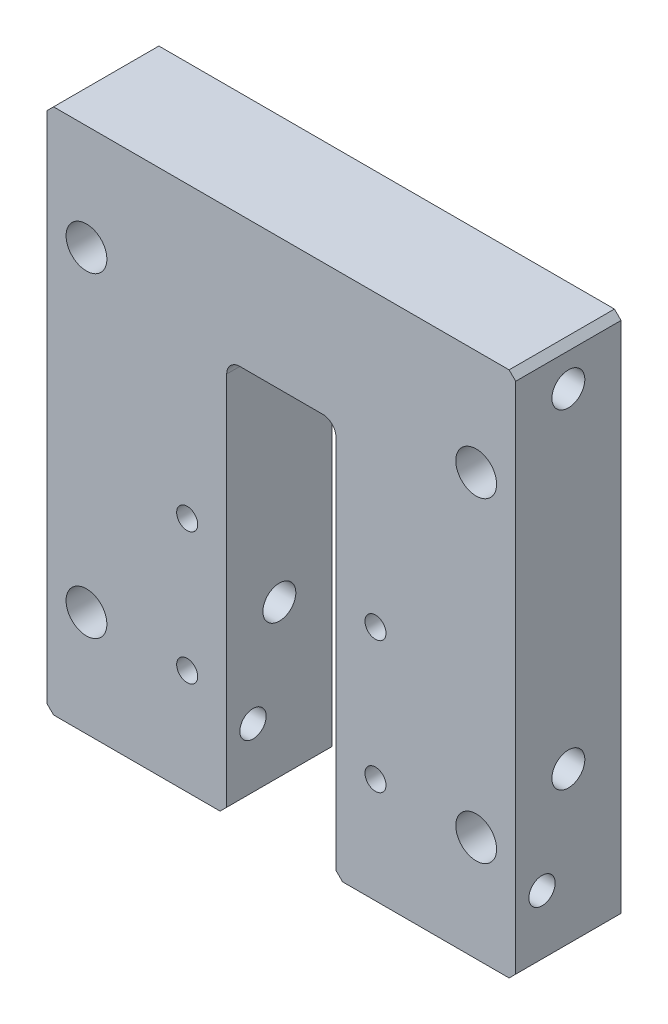
ISO-10303-21;
HEADER;
FILE_DESCRIPTION(('STEP AP214'),'2;1');
FILE_NAME('part.step','',(''),(''),'','','');
FILE_SCHEMA(('AUTOMOTIVE_DESIGN { 1 0 10303 214 1 1 1 1 }'));
ENDSEC;
DATA;
#1=APPLICATION_CONTEXT('core data for automotive mechanical design processes');
#2=APPLICATION_PROTOCOL_DEFINITION('international standard','automotive_design',2000,#1);
#3=PRODUCT_CONTEXT('',#1,'mechanical');
#4=PRODUCT('Part','Part','',(#3));
#5=PRODUCT_RELATED_PRODUCT_CATEGORY('part','',(#4));
#6=PRODUCT_DEFINITION_FORMATION('','',#4);
#7=PRODUCT_DEFINITION_CONTEXT('part definition',#1,'design');
#8=PRODUCT_DEFINITION('design','',#6,#7);
#9=PRODUCT_DEFINITION_SHAPE('','',#8);
#10=(LENGTH_UNIT() NAMED_UNIT(*) SI_UNIT(.MILLI.,.METRE.));
#11=(NAMED_UNIT(*) PLANE_ANGLE_UNIT() SI_UNIT($,.RADIAN.));
#12=(NAMED_UNIT(*) SI_UNIT($,.STERADIAN.) SOLID_ANGLE_UNIT());
#13=UNCERTAINTY_MEASURE_WITH_UNIT(LENGTH_MEASURE(1.E-05),#10,'distance_accuracy_value','');
#14=(GEOMETRIC_REPRESENTATION_CONTEXT(3) GLOBAL_UNCERTAINTY_ASSIGNED_CONTEXT((#13)) GLOBAL_UNIT_ASSIGNED_CONTEXT((#10,
#11,#12)) REPRESENTATION_CONTEXT('',''));
#15=CARTESIAN_POINT('',(0.,0.,0.));
#16=DIRECTION('',(0.,0.,1.));
#17=DIRECTION('',(1.,0.,0.));
#18=AXIS2_PLACEMENT_3D('',#15,#16,#17);
#19=CARTESIAN_POINT('',(0.,0.,8.));
#20=DIRECTION('',(0.,0.,-1.));
#21=DIRECTION('',(-1.,0.,0.));
#22=AXIS2_PLACEMENT_3D('',#19,#20,#21);
#23=PLANE('',#22);
#24=CARTESIAN_POINT('',(7.15,-12.,8.));
#25=DIRECTION('',(0.,0.,1.));
#26=DIRECTION('',(1.,0.,0.));
#27=AXIS2_PLACEMENT_3D('',#24,#25,#26);
#28=CIRCLE('',#27,0.799999999999999);
#29=CARTESIAN_POINT('',(7.95,-12.,8.));
#30=VERTEX_POINT('',#29);
#31=EDGE_CURVE('E385',#30,#30,#28,.T.);
#32=ORIENTED_EDGE('',*,*,#31,.F.);
#33=EDGE_LOOP('',(#32));
#34=FACE_BOUND('',#33,.T.);
#35=CARTESIAN_POINT('',(-7.15,-2.,8.));
#36=DIRECTION('',(0.,0.,1.));
#37=DIRECTION('',(1.,0.,0.));
#38=AXIS2_PLACEMENT_3D('',#35,#36,#37);
#39=CIRCLE('',#38,0.799999999999999);
#40=CARTESIAN_POINT('',(-6.35,-2.,8.));
#41=VERTEX_POINT('',#40);
#42=EDGE_CURVE('E367',#41,#41,#39,.T.);
#43=ORIENTED_EDGE('',*,*,#42,.F.);
#44=EDGE_LOOP('',(#43));
#45=FACE_BOUND('',#44,.T.);
#46=CARTESIAN_POINT('',(14.8,-12.,8.));
#47=DIRECTION('',(0.,0.,1.));
#48=DIRECTION('',(1.,0.,0.));
#49=AXIS2_PLACEMENT_3D('',#46,#47,#48);
#50=CIRCLE('',#49,1.55);
#51=CARTESIAN_POINT('',(16.35,-12.,8.));
#52=VERTEX_POINT('',#51);
#53=EDGE_CURVE('E356',#52,#52,#50,.T.);
#54=ORIENTED_EDGE('',*,*,#53,.F.);
#55=EDGE_LOOP('',(#54));
#56=FACE_BOUND('',#55,.T.);
#57=CARTESIAN_POINT('',(-14.8,-12.,8.));
#58=DIRECTION('',(0.,0.,1.));
#59=DIRECTION('',(1.,0.,0.));
#60=AXIS2_PLACEMENT_3D('',#57,#58,#59);
#61=CIRCLE('',#60,1.55);
#62=CARTESIAN_POINT('',(-13.25,-12.,8.));
#63=VERTEX_POINT('',#62);
#64=EDGE_CURVE('E359',#63,#63,#61,.T.);
#65=ORIENTED_EDGE('',*,*,#64,.F.);
#66=EDGE_LOOP('',(#65));
#67=FACE_BOUND('',#66,.T.);
#68=CARTESIAN_POINT('',(-14.8,12.,8.));
#69=DIRECTION('',(0.,0.,1.));
#70=DIRECTION('',(1.,0.,0.));
#71=AXIS2_PLACEMENT_3D('',#68,#69,#70);
#72=CIRCLE('',#71,1.55);
#73=CARTESIAN_POINT('',(-13.25,12.,8.));
#74=VERTEX_POINT('',#73);
#75=EDGE_CURVE('E355',#74,#74,#72,.T.);
#76=ORIENTED_EDGE('',*,*,#75,.F.);
#77=EDGE_LOOP('',(#76));
#78=FACE_BOUND('',#77,.T.);
#79=CARTESIAN_POINT('',(14.8,12.,8.));
#80=DIRECTION('',(0.,0.,1.));
#81=DIRECTION('',(1.,0.,0.));
#82=AXIS2_PLACEMENT_3D('',#79,#80,#81);
#83=CIRCLE('',#82,1.55);
#84=CARTESIAN_POINT('',(16.35,12.,8.));
#85=VERTEX_POINT('',#84);
#86=EDGE_CURVE('E273',#85,#85,#83,.T.);
#87=ORIENTED_EDGE('',*,*,#86,.F.);
#88=EDGE_LOOP('',(#87));
#89=FACE_BOUND('',#88,.T.);
#90=DIRECTION('',(0.,1.,0.));
#91=VECTOR('',#90,1.);
#92=CARTESIAN_POINT('',(17.8,-20.,8.));
#93=LINE('',#92,#91);
#94=CARTESIAN_POINT('',(17.8,-19.5,8.));
#95=VERTEX_POINT('',#94);
#96=CARTESIAN_POINT('',(17.8,19.5,8.));
#97=VERTEX_POINT('',#96);
#98=EDGE_CURVE('E316',#95,#97,#93,.T.);
#99=ORIENTED_EDGE('',*,*,#98,.T.);
#100=DIRECTION('',(0.707106781186543,-0.707106781186552,0.));
#101=VECTOR('',#100,1.);
#102=CARTESIAN_POINT('',(17.3,20.,8.));
#103=LINE('',#102,#101);
#104=CARTESIAN_POINT('',(17.3,20.,8.));
#105=VERTEX_POINT('',#104);
#106=EDGE_CURVE('E220',#97,#105,#103,.F.);
#107=ORIENTED_EDGE('',*,*,#106,.T.);
#108=DIRECTION('',(-1.,0.,0.));
#109=VECTOR('',#108,1.);
#110=CARTESIAN_POINT('',(-17.8,20.,8.));
#111=LINE('',#110,#109);
#112=CARTESIAN_POINT('',(-17.3,20.,8.));
#113=VERTEX_POINT('',#112);
#114=EDGE_CURVE('E318',#105,#113,#111,.T.);
#115=ORIENTED_EDGE('',*,*,#114,.T.);
#116=DIRECTION('',(0.707106781186552,0.707106781186543,0.));
#117=VECTOR('',#116,1.);
#118=CARTESIAN_POINT('',(-17.8,19.5,8.));
#119=LINE('',#118,#117);
#120=CARTESIAN_POINT('',(-17.8,19.5,8.));
#121=VERTEX_POINT('',#120);
#122=EDGE_CURVE('E211',#113,#121,#119,.F.);
#123=ORIENTED_EDGE('',*,*,#122,.T.);
#124=DIRECTION('',(0.,-1.,0.));
#125=VECTOR('',#124,1.);
#126=CARTESIAN_POINT('',(-17.8,-20.,8.));
#127=LINE('',#126,#125);
#128=CARTESIAN_POINT('',(-17.8,-19.5,8.));
#129=VERTEX_POINT('',#128);
#130=EDGE_CURVE('E245',#121,#129,#127,.T.);
#131=ORIENTED_EDGE('',*,*,#130,.T.);
#132=DIRECTION('',(-0.707106781186543,0.707106781186552,0.));
#133=VECTOR('',#132,1.);
#134=CARTESIAN_POINT('',(-17.3,-20.,8.));
#135=LINE('',#134,#133);
#136=CARTESIAN_POINT('',(-17.3,-20.,8.));
#137=VERTEX_POINT('',#136);
#138=EDGE_CURVE('E213',#129,#137,#135,.F.);
#139=ORIENTED_EDGE('',*,*,#138,.T.);
#140=DIRECTION('',(1.,0.,0.));
#141=VECTOR('',#140,1.);
#142=CARTESIAN_POINT('',(-17.8,-20.,8.));
#143=LINE('',#142,#141);
#144=CARTESIAN_POINT('',(-4.64999999999999,-20.,8.));
#145=VERTEX_POINT('',#144);
#146=EDGE_CURVE('E179',#137,#145,#143,.T.);
#147=ORIENTED_EDGE('',*,*,#146,.T.);
#148=DIRECTION('',(-0.707106781186548,-0.707106781186547,0.));
#149=VECTOR('',#148,1.);
#150=CARTESIAN_POINT('',(-4.64999999999999,-20.,8.));
#151=LINE('',#150,#149);
#152=CARTESIAN_POINT('',(-4.14999999999999,-19.5,8.));
#153=VERTEX_POINT('',#152);
#154=EDGE_CURVE('E58',#145,#153,#151,.F.);
#155=ORIENTED_EDGE('',*,*,#154,.T.);
#156=DIRECTION('',(0.,-1.,0.));
#157=VECTOR('',#156,1.);
#158=CARTESIAN_POINT('',(-4.14999999999999,-50.,8.));
#159=LINE('',#158,#157);
#160=CARTESIAN_POINT('',(-4.15,9.,8.));
#161=VERTEX_POINT('',#160);
#162=EDGE_CURVE('E264',#161,#153,#159,.T.);
#163=ORIENTED_EDGE('',*,*,#162,.F.);
#164=CARTESIAN_POINT('',(-3.15,9.,8.));
#165=DIRECTION('',(0.,0.,-1.));
#166=DIRECTION('',(-1.,0.,0.));
#167=AXIS2_PLACEMENT_3D('',#164,#165,#166);
#168=CIRCLE('',#167,1.);
#169=CARTESIAN_POINT('',(-3.15,10.,8.));
#170=VERTEX_POINT('',#169);
#171=EDGE_CURVE('E185',#161,#170,#168,.T.);
#172=ORIENTED_EDGE('',*,*,#171,.T.);
#173=DIRECTION('',(-1.,0.,0.));
#174=VECTOR('',#173,1.);
#175=CARTESIAN_POINT('',(-4.15,10.,8.));
#176=LINE('',#175,#174);
#177=CARTESIAN_POINT('',(3.15,10.,8.));
#178=VERTEX_POINT('',#177);
#179=EDGE_CURVE('E164',#178,#170,#176,.T.);
#180=ORIENTED_EDGE('',*,*,#179,.F.);
#181=CARTESIAN_POINT('',(3.15,9.,8.));
#182=DIRECTION('',(0.,0.,-1.));
#183=DIRECTION('',(-1.,0.,0.));
#184=AXIS2_PLACEMENT_3D('',#181,#182,#183);
#185=CIRCLE('',#184,1.);
#186=CARTESIAN_POINT('',(4.15,9.,8.));
#187=VERTEX_POINT('',#186);
#188=EDGE_CURVE('E292',#178,#187,#185,.T.);
#189=ORIENTED_EDGE('',*,*,#188,.T.);
#190=DIRECTION('',(0.,1.,0.));
#191=VECTOR('',#190,1.);
#192=CARTESIAN_POINT('',(4.15,-50.,8.));
#193=LINE('',#192,#191);
#194=CARTESIAN_POINT('',(4.15,-19.5,8.));
#195=VERTEX_POINT('',#194);
#196=EDGE_CURVE('E282',#195,#187,#193,.T.);
#197=ORIENTED_EDGE('',*,*,#196,.F.);
#198=DIRECTION('',(-0.707106781186548,0.707106781186547,0.));
#199=VECTOR('',#198,1.);
#200=CARTESIAN_POINT('',(4.65,-20.,8.));
#201=LINE('',#200,#199);
#202=CARTESIAN_POINT('',(4.65,-20.,8.));
#203=VERTEX_POINT('',#202);
#204=EDGE_CURVE('E216',#195,#203,#201,.F.);
#205=ORIENTED_EDGE('',*,*,#204,.T.);
#206=CARTESIAN_POINT('',(17.3,-20.,8.));
#207=VERTEX_POINT('',#206);
#208=EDGE_CURVE('E322',#203,#207,#143,.T.);
#209=ORIENTED_EDGE('',*,*,#208,.T.);
#210=DIRECTION('',(-0.707106781186552,-0.707106781186543,0.));
#211=VECTOR('',#210,1.);
#212=CARTESIAN_POINT('',(17.8,-19.5,8.));
#213=LINE('',#212,#211);
#214=EDGE_CURVE('E218',#207,#95,#213,.F.);
#215=ORIENTED_EDGE('',*,*,#214,.T.);
#216=EDGE_LOOP('',(#99,#107,#115,#123,#131,#139,#147,#155,#163,#172,#180,#189,#197,#205,#209,#215));
#217=FACE_BOUND('',#216,.T.);
#218=CARTESIAN_POINT('',(-7.15,-12.,8.));
#219=DIRECTION('',(0.,0.,1.));
#220=DIRECTION('',(1.,0.,0.));
#221=AXIS2_PLACEMENT_3D('',#218,#219,#220);
#222=CIRCLE('',#221,0.799999999999999);
#223=CARTESIAN_POINT('',(-6.35,-12.,8.));
#224=VERTEX_POINT('',#223);
#225=EDGE_CURVE('E373',#224,#224,#222,.T.);
#226=ORIENTED_EDGE('',*,*,#225,.F.);
#227=EDGE_LOOP('',(#226));
#228=FACE_BOUND('',#227,.T.);
#229=CARTESIAN_POINT('',(7.15,-2.,8.));
#230=DIRECTION('',(0.,0.,1.));
#231=DIRECTION('',(1.,0.,0.));
#232=AXIS2_PLACEMENT_3D('',#229,#230,#231);
#233=CIRCLE('',#232,0.799999999999999);
#234=CARTESIAN_POINT('',(7.95,-2.,8.));
#235=VERTEX_POINT('',#234);
#236=EDGE_CURVE('E379',#235,#235,#233,.T.);
#237=ORIENTED_EDGE('',*,*,#236,.F.);
#238=EDGE_LOOP('',(#237));
#239=FACE_BOUND('',#238,.T.);
#240=ADVANCED_FACE('F42',(#34,#45,#56,#67,#78,#89,#217,#228,#239),#23,.F.);
#241=CARTESIAN_POINT('',(-17.8,-20.,8.));
#242=DIRECTION('',(0.,1.,0.));
#243=DIRECTION('',(0.,0.,1.));
#244=AXIS2_PLACEMENT_3D('',#241,#242,#243);
#245=PLANE('',#244);
#246=DIRECTION('',(1.,0.,0.));
#247=VECTOR('',#246,1.);
#248=CARTESIAN_POINT('',(-17.8,-20.,0.));
#249=LINE('',#248,#247);
#250=CARTESIAN_POINT('',(4.65,-20.,0.));
#251=VERTEX_POINT('',#250);
#252=CARTESIAN_POINT('',(17.3,-20.,0.));
#253=VERTEX_POINT('',#252);
#254=EDGE_CURVE('E250',#251,#253,#249,.T.);
#255=ORIENTED_EDGE('',*,*,#254,.T.);
#256=DIRECTION('',(0.,0.,1.));
#257=VECTOR('',#256,1.);
#258=CARTESIAN_POINT('',(17.3,-20.,8.));
#259=LINE('',#258,#257);
#260=EDGE_CURVE('E225',#253,#207,#259,.T.);
#261=ORIENTED_EDGE('',*,*,#260,.T.);
#262=ORIENTED_EDGE('',*,*,#208,.F.);
#263=DIRECTION('',(0.,0.,-1.));
#264=VECTOR('',#263,1.);
#265=CARTESIAN_POINT('',(4.65,-20.,8.));
#266=LINE('',#265,#264);
#267=EDGE_CURVE('E222',#203,#251,#266,.T.);
#268=ORIENTED_EDGE('',*,*,#267,.T.);
#269=EDGE_LOOP('',(#255,#261,#262,#268));
#270=FACE_BOUND('',#269,.T.);
#271=ADVANCED_FACE('F426',(#270),#245,.F.);
#272=CARTESIAN_POINT('',(24.2,-15.,6.));
#273=DIRECTION('',(-1.,0.,0.));
#274=DIRECTION('',(0.,0.,1.));
#275=AXIS2_PLACEMENT_3D('',#272,#273,#274);
#276=CYLINDRICAL_SURFACE('',#275,1.);
#277=CARTESIAN_POINT('',(4.15,-15.,6.));
#278=DIRECTION('',(1.,0.,0.));
#279=DIRECTION('',(0.,0.,-1.));
#280=AXIS2_PLACEMENT_3D('',#277,#278,#279);
#281=CIRCLE('',#280,1.);
#282=CARTESIAN_POINT('',(4.15,-15.,5.));
#283=VERTEX_POINT('',#282);
#284=EDGE_CURVE('E265',#283,#283,#281,.F.);
#285=ORIENTED_EDGE('',*,*,#284,.T.);
#286=EDGE_LOOP('',(#285));
#287=FACE_BOUND('',#286,.T.);
#288=CARTESIAN_POINT('',(17.8,-15.,6.));
#289=DIRECTION('',(-1.,0.,0.));
#290=DIRECTION('',(0.,0.,1.));
#291=AXIS2_PLACEMENT_3D('',#288,#289,#290);
#292=CIRCLE('',#291,1.);
#293=CARTESIAN_POINT('',(17.8,-15.,7.));
#294=VERTEX_POINT('',#293);
#295=EDGE_CURVE('E309',#294,#294,#292,.T.);
#296=ORIENTED_EDGE('',*,*,#295,.F.);
#297=EDGE_LOOP('',(#296));
#298=FACE_BOUND('',#297,.T.);
#299=ADVANCED_FACE('F415',(#287,#298),#276,.F.);
#300=CARTESIAN_POINT('',(17.8,-20.,8.));
#301=DIRECTION('',(-1.,0.,0.));
#302=DIRECTION('',(0.,0.,1.));
#303=AXIS2_PLACEMENT_3D('',#300,#301,#302);
#304=PLANE('',#303);
#305=CARTESIAN_POINT('',(17.8,17.,4.));
#306=DIRECTION('',(-1.,0.,0.));
#307=DIRECTION('',(0.,0.,1.));
#308=AXIS2_PLACEMENT_3D('',#305,#306,#307);
#309=CIRCLE('',#308,1.24999999999999);
#310=CARTESIAN_POINT('',(17.8,17.,5.24999999999999));
#311=VERTEX_POINT('',#310);
#312=EDGE_CURVE('E395',#311,#311,#309,.T.);
#313=ORIENTED_EDGE('',*,*,#312,.T.);
#314=EDGE_LOOP('',(#313));
#315=FACE_BOUND('',#314,.T.);
#316=CARTESIAN_POINT('',(17.8,-8.,4.));
#317=DIRECTION('',(-1.,0.,0.));
#318=DIRECTION('',(0.,0.,1.));
#319=AXIS2_PLACEMENT_3D('',#316,#317,#318);
#320=CIRCLE('',#319,1.24999999999999);
#321=CARTESIAN_POINT('',(17.8,-8.,5.24999999999999));
#322=VERTEX_POINT('',#321);
#323=EDGE_CURVE('E286',#322,#322,#320,.T.);
#324=ORIENTED_EDGE('',*,*,#323,.T.);
#325=EDGE_LOOP('',(#324));
#326=FACE_BOUND('',#325,.T.);
#327=ORIENTED_EDGE('',*,*,#295,.T.);
#328=EDGE_LOOP('',(#327));
#329=FACE_BOUND('',#328,.T.);
#330=DIRECTION('',(0.,1.,0.));
#331=VECTOR('',#330,1.);
#332=CARTESIAN_POINT('',(17.8,-20.,0.));
#333=LINE('',#332,#331);
#334=CARTESIAN_POINT('',(17.8,-19.5,0.));
#335=VERTEX_POINT('',#334);
#336=CARTESIAN_POINT('',(17.8,19.5,0.));
#337=VERTEX_POINT('',#336);
#338=EDGE_CURVE('E256',#335,#337,#333,.T.);
#339=ORIENTED_EDGE('',*,*,#338,.T.);
#340=DIRECTION('',(0.,0.,1.));
#341=VECTOR('',#340,1.);
#342=CARTESIAN_POINT('',(17.8,19.5,8.));
#343=LINE('',#342,#341);
#344=EDGE_CURVE('E209',#337,#97,#343,.T.);
#345=ORIENTED_EDGE('',*,*,#344,.T.);
#346=ORIENTED_EDGE('',*,*,#98,.F.);
#347=DIRECTION('',(0.,0.,-1.));
#348=VECTOR('',#347,1.);
#349=CARTESIAN_POINT('',(17.8,-19.5,8.));
#350=LINE('',#349,#348);
#351=EDGE_CURVE('E206',#95,#335,#350,.T.);
#352=ORIENTED_EDGE('',*,*,#351,.T.);
#353=EDGE_LOOP('',(#339,#345,#346,#352));
#354=FACE_BOUND('',#353,.T.);
#355=ADVANCED_FACE('F327',(#315,#326,#329,#354),#304,.F.);
#356=CARTESIAN_POINT('',(-17.8,20.,8.));
#357=DIRECTION('',(0.,-1.,0.));
#358=DIRECTION('',(0.,0.,-1.));
#359=AXIS2_PLACEMENT_3D('',#356,#357,#358);
#360=PLANE('',#359);
#361=ORIENTED_EDGE('',*,*,#114,.F.);
#362=DIRECTION('',(0.,0.,-1.));
#363=VECTOR('',#362,1.);
#364=CARTESIAN_POINT('',(17.3,20.,8.));
#365=LINE('',#364,#363);
#366=CARTESIAN_POINT('',(17.3,20.,0.));
#367=VERTEX_POINT('',#366);
#368=EDGE_CURVE('E187',#105,#367,#365,.T.);
#369=ORIENTED_EDGE('',*,*,#368,.T.);
#370=DIRECTION('',(-1.,0.,0.));
#371=VECTOR('',#370,1.);
#372=CARTESIAN_POINT('',(-17.8,20.,0.));
#373=LINE('',#372,#371);
#374=CARTESIAN_POINT('',(-17.3,20.,0.));
#375=VERTEX_POINT('',#374);
#376=EDGE_CURVE('E251',#367,#375,#373,.T.);
#377=ORIENTED_EDGE('',*,*,#376,.T.);
#378=DIRECTION('',(0.,0.,1.));
#379=VECTOR('',#378,1.);
#380=CARTESIAN_POINT('',(-17.3,20.,8.));
#381=LINE('',#380,#379);
#382=EDGE_CURVE('E184',#375,#113,#381,.T.);
#383=ORIENTED_EDGE('',*,*,#382,.T.);
#384=EDGE_LOOP('',(#361,#369,#377,#383));
#385=FACE_BOUND('',#384,.T.);
#386=ADVANCED_FACE('F336',(#385),#360,.F.);
#387=CARTESIAN_POINT('',(-17.8,-20.,8.));
#388=DIRECTION('',(1.,0.,0.));
#389=DIRECTION('',(0.,0.,-1.));
#390=AXIS2_PLACEMENT_3D('',#387,#388,#389);
#391=PLANE('',#390);
#392=CARTESIAN_POINT('',(-17.8,17.,4.));
#393=DIRECTION('',(-1.,0.,0.));
#394=DIRECTION('',(0.,0.,1.));
#395=AXIS2_PLACEMENT_3D('',#392,#393,#394);
#396=CIRCLE('',#395,1.25);
#397=CARTESIAN_POINT('',(-17.8,17.,5.25));
#398=VERTEX_POINT('',#397);
#399=EDGE_CURVE('E398',#398,#398,#396,.T.);
#400=ORIENTED_EDGE('',*,*,#399,.F.);
#401=EDGE_LOOP('',(#400));
#402=FACE_BOUND('',#401,.T.);
#403=CARTESIAN_POINT('',(-17.8,-8.,4.));
#404=DIRECTION('',(-1.,0.,0.));
#405=DIRECTION('',(0.,0.,1.));
#406=AXIS2_PLACEMENT_3D('',#403,#404,#405);
#407=CIRCLE('',#406,1.25);
#408=CARTESIAN_POINT('',(-17.8,-8.,5.25));
#409=VERTEX_POINT('',#408);
#410=EDGE_CURVE('E392',#409,#409,#407,.T.);
#411=ORIENTED_EDGE('',*,*,#410,.F.);
#412=EDGE_LOOP('',(#411));
#413=FACE_BOUND('',#412,.T.);
#414=CARTESIAN_POINT('',(-17.8,-15.,6.));
#415=DIRECTION('',(-1.,0.,0.));
#416=DIRECTION('',(0.,0.,1.));
#417=AXIS2_PLACEMENT_3D('',#414,#415,#416);
#418=CIRCLE('',#417,1.);
#419=CARTESIAN_POINT('',(-17.8,-15.,7.));
#420=VERTEX_POINT('',#419);
#421=EDGE_CURVE('E306',#420,#420,#418,.T.);
#422=ORIENTED_EDGE('',*,*,#421,.F.);
#423=EDGE_LOOP('',(#422));
#424=FACE_BOUND('',#423,.T.);
#425=DIRECTION('',(0.,-1.,0.));
#426=VECTOR('',#425,1.);
#427=CARTESIAN_POINT('',(-17.8,-20.,0.));
#428=LINE('',#427,#426);
#429=CARTESIAN_POINT('',(-17.8,19.5,0.));
#430=VERTEX_POINT('',#429);
#431=CARTESIAN_POINT('',(-17.8,-19.5,0.));
#432=VERTEX_POINT('',#431);
#433=EDGE_CURVE('E242',#430,#432,#428,.T.);
#434=ORIENTED_EDGE('',*,*,#433,.T.);
#435=DIRECTION('',(0.,0.,1.));
#436=VECTOR('',#435,1.);
#437=CARTESIAN_POINT('',(-17.8,-19.5,8.));
#438=LINE('',#437,#436);
#439=EDGE_CURVE('E11',#432,#129,#438,.T.);
#440=ORIENTED_EDGE('',*,*,#439,.T.);
#441=ORIENTED_EDGE('',*,*,#130,.F.);
#442=DIRECTION('',(0.,0.,-1.));
#443=VECTOR('',#442,1.);
#444=CARTESIAN_POINT('',(-17.8,19.5,8.));
#445=LINE('',#444,#443);
#446=EDGE_CURVE('E51',#121,#430,#445,.T.);
#447=ORIENTED_EDGE('',*,*,#446,.T.);
#448=EDGE_LOOP('',(#434,#440,#441,#447));
#449=FACE_BOUND('',#448,.T.);
#450=ADVANCED_FACE('F241',(#402,#413,#424,#449),#391,.F.);
#451=CARTESIAN_POINT('',(-17.3,-20.,0.));
#452=VERTEX_POINT('',#451);
#453=CARTESIAN_POINT('',(-4.64999999999999,-20.,0.));
#454=VERTEX_POINT('',#453);
#455=EDGE_CURVE('E254',#452,#454,#249,.T.);
#456=ORIENTED_EDGE('',*,*,#455,.T.);
#457=DIRECTION('',(0.,0.,1.));
#458=VECTOR('',#457,1.);
#459=CARTESIAN_POINT('',(-4.64999999999999,-20.,8.));
#460=LINE('',#459,#458);
#461=EDGE_CURVE('E232',#454,#145,#460,.T.);
#462=ORIENTED_EDGE('',*,*,#461,.T.);
#463=ORIENTED_EDGE('',*,*,#146,.F.);
#464=DIRECTION('',(0.,0.,-1.));
#465=VECTOR('',#464,1.);
#466=CARTESIAN_POINT('',(-17.3,-20.,8.));
#467=LINE('',#466,#465);
#468=EDGE_CURVE('E229',#137,#452,#467,.T.);
#469=ORIENTED_EDGE('',*,*,#468,.T.);
#470=EDGE_LOOP('',(#456,#462,#463,#469));
#471=FACE_BOUND('',#470,.T.);
#472=ADVANCED_FACE('F345',(#471),#245,.F.);
#473=CARTESIAN_POINT('',(0.,0.,0.));
#474=DIRECTION('',(0.,0.,-1.));
#475=DIRECTION('',(-1.,0.,0.));
#476=AXIS2_PLACEMENT_3D('',#473,#474,#475);
#477=PLANE('',#476);
#478=CARTESIAN_POINT('',(7.15,-12.,0.));
#479=DIRECTION('',(0.,0.,1.));
#480=DIRECTION('',(1.,0.,0.));
#481=AXIS2_PLACEMENT_3D('',#478,#479,#480);
#482=CIRCLE('',#481,0.799999999999999);
#483=CARTESIAN_POINT('',(7.95,-12.,0.));
#484=VERTEX_POINT('',#483);
#485=EDGE_CURVE('E382',#484,#484,#482,.T.);
#486=ORIENTED_EDGE('',*,*,#485,.T.);
#487=EDGE_LOOP('',(#486));
#488=FACE_BOUND('',#487,.T.);
#489=CARTESIAN_POINT('',(7.15,-2.,0.));
#490=DIRECTION('',(0.,0.,1.));
#491=DIRECTION('',(1.,0.,0.));
#492=AXIS2_PLACEMENT_3D('',#489,#490,#491);
#493=CIRCLE('',#492,0.799999999999998);
#494=CARTESIAN_POINT('',(7.95,-2.,0.));
#495=VERTEX_POINT('',#494);
#496=EDGE_CURVE('E376',#495,#495,#493,.T.);
#497=ORIENTED_EDGE('',*,*,#496,.T.);
#498=EDGE_LOOP('',(#497));
#499=FACE_BOUND('',#498,.T.);
#500=CARTESIAN_POINT('',(-7.15,-12.,0.));
#501=DIRECTION('',(0.,0.,1.));
#502=DIRECTION('',(1.,0.,0.));
#503=AXIS2_PLACEMENT_3D('',#500,#501,#502);
#504=CIRCLE('',#503,0.799999999999998);
#505=CARTESIAN_POINT('',(-6.35,-12.,0.));
#506=VERTEX_POINT('',#505);
#507=EDGE_CURVE('E370',#506,#506,#504,.T.);
#508=ORIENTED_EDGE('',*,*,#507,.T.);
#509=EDGE_LOOP('',(#508));
#510=FACE_BOUND('',#509,.T.);
#511=CARTESIAN_POINT('',(-7.15,-2.,0.));
#512=DIRECTION('',(0.,0.,1.));
#513=DIRECTION('',(1.,0.,0.));
#514=AXIS2_PLACEMENT_3D('',#511,#512,#513);
#515=CIRCLE('',#514,0.799999999999998);
#516=CARTESIAN_POINT('',(-6.35,-2.,0.));
#517=VERTEX_POINT('',#516);
#518=EDGE_CURVE('E360',#517,#517,#515,.T.);
#519=ORIENTED_EDGE('',*,*,#518,.T.);
#520=EDGE_LOOP('',(#519));
#521=FACE_BOUND('',#520,.T.);
#522=CARTESIAN_POINT('',(14.8,-12.,0.));
#523=DIRECTION('',(0.,0.,-1.));
#524=DIRECTION('',(-1.,0.,0.));
#525=AXIS2_PLACEMENT_3D('',#522,#523,#524);
#526=CIRCLE('',#525,1.55);
#527=CARTESIAN_POINT('',(13.25,-12.,0.));
#528=VERTEX_POINT('',#527);
#529=EDGE_CURVE('E279',#528,#528,#526,.T.);
#530=ORIENTED_EDGE('',*,*,#529,.F.);
#531=EDGE_LOOP('',(#530));
#532=FACE_BOUND('',#531,.T.);
#533=CARTESIAN_POINT('',(-14.8,-12.,0.));
#534=DIRECTION('',(0.,0.,-1.));
#535=DIRECTION('',(-1.,0.,0.));
#536=AXIS2_PLACEMENT_3D('',#533,#534,#535);
#537=CIRCLE('',#536,1.55);
#538=CARTESIAN_POINT('',(-16.35,-12.,0.));
#539=VERTEX_POINT('',#538);
#540=EDGE_CURVE('E276',#539,#539,#537,.T.);
#541=ORIENTED_EDGE('',*,*,#540,.F.);
#542=EDGE_LOOP('',(#541));
#543=FACE_BOUND('',#542,.T.);
#544=CARTESIAN_POINT('',(-14.8,12.,0.));
#545=DIRECTION('',(0.,0.,-1.));
#546=DIRECTION('',(-1.,0.,0.));
#547=AXIS2_PLACEMENT_3D('',#544,#545,#546);
#548=CIRCLE('',#547,1.55);
#549=CARTESIAN_POINT('',(-16.35,12.,0.));
#550=VERTEX_POINT('',#549);
#551=EDGE_CURVE('E272',#550,#550,#548,.T.);
#552=ORIENTED_EDGE('',*,*,#551,.F.);
#553=EDGE_LOOP('',(#552));
#554=FACE_BOUND('',#553,.T.);
#555=CARTESIAN_POINT('',(14.8,12.,0.));
#556=DIRECTION('',(0.,0.,-1.));
#557=DIRECTION('',(-1.,0.,0.));
#558=AXIS2_PLACEMENT_3D('',#555,#556,#557);
#559=CIRCLE('',#558,1.55);
#560=CARTESIAN_POINT('',(13.25,12.,0.));
#561=VERTEX_POINT('',#560);
#562=EDGE_CURVE('E269',#561,#561,#559,.T.);
#563=ORIENTED_EDGE('',*,*,#562,.F.);
#564=EDGE_LOOP('',(#563));
#565=FACE_BOUND('',#564,.T.);
#566=ORIENTED_EDGE('',*,*,#376,.F.);
#567=DIRECTION('',(-0.707106781186543,0.707106781186552,0.));
#568=VECTOR('',#567,1.);
#569=CARTESIAN_POINT('',(18.6500000000001,18.6499999999999,0.));
#570=LINE('',#569,#568);
#571=EDGE_CURVE('E204',#367,#337,#570,.F.);
#572=ORIENTED_EDGE('',*,*,#571,.T.);
#573=ORIENTED_EDGE('',*,*,#338,.F.);
#574=DIRECTION('',(0.707106781186552,0.707106781186543,0.));
#575=VECTOR('',#574,1.);
#576=CARTESIAN_POINT('',(18.6499999999999,-18.6500000000001,0.));
#577=LINE('',#576,#575);
#578=EDGE_CURVE('E202',#335,#253,#577,.F.);
#579=ORIENTED_EDGE('',*,*,#578,.T.);
#580=ORIENTED_EDGE('',*,*,#254,.F.);
#581=DIRECTION('',(0.707106781186548,-0.707106781186547,0.));
#582=VECTOR('',#581,1.);
#583=CARTESIAN_POINT('',(-7.675,-7.67500000000002,0.));
#584=LINE('',#583,#582);
#585=CARTESIAN_POINT('',(4.15,-19.5,0.));
#586=VERTEX_POINT('',#585);
#587=EDGE_CURVE('E200',#251,#586,#584,.F.);
#588=ORIENTED_EDGE('',*,*,#587,.T.);
#589=DIRECTION('',(0.,-1.,0.));
#590=VECTOR('',#589,1.);
#591=CARTESIAN_POINT('',(4.15,0.,0.));
#592=LINE('',#591,#590);
#593=CARTESIAN_POINT('',(4.15,9.,0.));
#594=VERTEX_POINT('',#593);
#595=EDGE_CURVE('E267',#594,#586,#592,.T.);
#596=ORIENTED_EDGE('',*,*,#595,.F.);
#597=CARTESIAN_POINT('',(3.15,9.,0.));
#598=DIRECTION('',(0.,0.,-1.));
#599=DIRECTION('',(-1.,0.,0.));
#600=AXIS2_PLACEMENT_3D('',#597,#598,#599);
#601=CIRCLE('',#600,1.);
#602=CARTESIAN_POINT('',(3.15,10.,0.));
#603=VERTEX_POINT('',#602);
#604=EDGE_CURVE('E178',#594,#603,#601,.F.);
#605=ORIENTED_EDGE('',*,*,#604,.T.);
#606=DIRECTION('',(1.,0.,0.));
#607=VECTOR('',#606,1.);
#608=CARTESIAN_POINT('',(0.,10.,0.));
#609=LINE('',#608,#607);
#610=CARTESIAN_POINT('',(-3.15,10.,0.));
#611=VERTEX_POINT('',#610);
#612=EDGE_CURVE('E161',#611,#603,#609,.T.);
#613=ORIENTED_EDGE('',*,*,#612,.F.);
#614=CARTESIAN_POINT('',(-3.15,9.,0.));
#615=DIRECTION('',(0.,0.,-1.));
#616=DIRECTION('',(-1.,0.,0.));
#617=AXIS2_PLACEMENT_3D('',#614,#615,#616);
#618=CIRCLE('',#617,1.);
#619=CARTESIAN_POINT('',(-4.15,9.,0.));
#620=VERTEX_POINT('',#619);
#621=EDGE_CURVE('E174',#611,#620,#618,.F.);
#622=ORIENTED_EDGE('',*,*,#621,.T.);
#623=DIRECTION('',(0.,1.,0.));
#624=VECTOR('',#623,1.);
#625=CARTESIAN_POINT('',(-4.15,0.,0.));
#626=LINE('',#625,#624);
#627=CARTESIAN_POINT('',(-4.14999999999999,-19.5,0.));
#628=VERTEX_POINT('',#627);
#629=EDGE_CURVE('E263',#628,#620,#626,.T.);
#630=ORIENTED_EDGE('',*,*,#629,.F.);
#631=DIRECTION('',(0.707106781186548,0.707106781186547,0.));
#632=VECTOR('',#631,1.);
#633=CARTESIAN_POINT('',(7.67500000000001,-7.67500000000002,0.));
#634=LINE('',#633,#632);
#635=EDGE_CURVE('E198',#628,#454,#634,.F.);
#636=ORIENTED_EDGE('',*,*,#635,.T.);
#637=ORIENTED_EDGE('',*,*,#455,.F.);
#638=DIRECTION('',(0.707106781186543,-0.707106781186552,0.));
#639=VECTOR('',#638,1.);
#640=CARTESIAN_POINT('',(-18.6500000000001,-18.6499999999999,0.));
#641=LINE('',#640,#639);
#642=EDGE_CURVE('E196',#452,#432,#641,.F.);
#643=ORIENTED_EDGE('',*,*,#642,.T.);
#644=ORIENTED_EDGE('',*,*,#433,.F.);
#645=DIRECTION('',(-0.707106781186552,-0.707106781186543,0.));
#646=VECTOR('',#645,1.);
#647=CARTESIAN_POINT('',(-18.6499999999999,18.6500000000001,0.));
#648=LINE('',#647,#646);
#649=EDGE_CURVE('E194',#430,#375,#648,.F.);
#650=ORIENTED_EDGE('',*,*,#649,.T.);
#651=EDGE_LOOP('',(#566,#572,#573,#579,#580,#588,#596,#605,#613,#622,#630,#636,#637,#643,#644,#650));
#652=FACE_BOUND('',#651,.T.);
#653=ADVANCED_FACE('F172',(#488,#499,#510,#521,#532,#543,#554,#565,#652),#477,.T.);
#654=CARTESIAN_POINT('',(-4.14999999999999,-15.,6.));
#655=DIRECTION('',(-1.,0.,0.));
#656=DIRECTION('',(0.,-1.,0.));
#657=AXIS2_PLACEMENT_3D('',#654,#655,#656);
#658=CIRCLE('',#657,1.);
#659=CARTESIAN_POINT('',(-4.14999999999999,-16.,6.));
#660=VERTEX_POINT('',#659);
#661=EDGE_CURVE('E260',#660,#660,#658,.F.);
#662=ORIENTED_EDGE('',*,*,#661,.T.);
#663=EDGE_LOOP('',(#662));
#664=FACE_BOUND('',#663,.T.);
#665=ORIENTED_EDGE('',*,*,#421,.T.);
#666=EDGE_LOOP('',(#665));
#667=FACE_BOUND('',#666,.T.);
#668=ADVANCED_FACE('F411',(#664,#667),#276,.F.);
#669=CARTESIAN_POINT('',(4.15,-50.,-2.));
#670=DIRECTION('',(1.,0.,0.));
#671=DIRECTION('',(0.,0.,-1.));
#672=AXIS2_PLACEMENT_3D('',#669,#670,#671);
#673=PLANE('',#672);
#674=CARTESIAN_POINT('',(4.15,-8.,4.));
#675=DIRECTION('',(1.,0.,0.));
#676=DIRECTION('',(0.,0.,-1.));
#677=AXIS2_PLACEMENT_3D('',#674,#675,#676);
#678=CIRCLE('',#677,1.25);
#679=CARTESIAN_POINT('',(4.15,-8.,2.75));
#680=VERTEX_POINT('',#679);
#681=EDGE_CURVE('E283',#680,#680,#678,.T.);
#682=ORIENTED_EDGE('',*,*,#681,.T.);
#683=EDGE_LOOP('',(#682));
#684=FACE_BOUND('',#683,.T.);
#685=ORIENTED_EDGE('',*,*,#284,.F.);
#686=EDGE_LOOP('',(#685));
#687=FACE_BOUND('',#686,.T.);
#688=ORIENTED_EDGE('',*,*,#595,.T.);
#689=DIRECTION('',(0.,0.,1.));
#690=VECTOR('',#689,1.);
#691=CARTESIAN_POINT('',(4.15,-19.5,-2.));
#692=LINE('',#691,#690);
#693=EDGE_CURVE('E227',#586,#195,#692,.T.);
#694=ORIENTED_EDGE('',*,*,#693,.T.);
#695=ORIENTED_EDGE('',*,*,#196,.T.);
#696=DIRECTION('',(0.,0.,1.));
#697=VECTOR('',#696,1.);
#698=CARTESIAN_POINT('',(4.15,9.,0.));
#699=LINE('',#698,#697);
#700=EDGE_CURVE('E289',#187,#594,#699,.F.);
#701=ORIENTED_EDGE('',*,*,#700,.T.);
#702=EDGE_LOOP('',(#688,#694,#695,#701));
#703=FACE_BOUND('',#702,.T.);
#704=ADVANCED_FACE('F303',(#684,#687,#703),#673,.F.);
#705=CARTESIAN_POINT('',(-4.14999999999999,-50.,-2.));
#706=DIRECTION('',(-1.,0.,0.));
#707=DIRECTION('',(0.,-1.,0.));
#708=AXIS2_PLACEMENT_3D('',#705,#706,#707);
#709=PLANE('',#708);
#710=CARTESIAN_POINT('',(-4.15,-8.,4.));
#711=DIRECTION('',(-1.,0.,0.));
#712=DIRECTION('',(0.,-1.,0.));
#713=AXIS2_PLACEMENT_3D('',#710,#711,#712);
#714=CIRCLE('',#713,1.25);
#715=CARTESIAN_POINT('',(-4.15,-9.25,4.));
#716=VERTEX_POINT('',#715);
#717=EDGE_CURVE('E285',#716,#716,#714,.T.);
#718=ORIENTED_EDGE('',*,*,#717,.T.);
#719=EDGE_LOOP('',(#718));
#720=FACE_BOUND('',#719,.T.);
#721=ORIENTED_EDGE('',*,*,#661,.F.);
#722=EDGE_LOOP('',(#721));
#723=FACE_BOUND('',#722,.T.);
#724=ORIENTED_EDGE('',*,*,#162,.T.);
#725=DIRECTION('',(0.,0.,-1.));
#726=VECTOR('',#725,1.);
#727=CARTESIAN_POINT('',(-4.14999999999999,-19.5,-2.));
#728=LINE('',#727,#726);
#729=EDGE_CURVE('E234',#153,#628,#728,.T.);
#730=ORIENTED_EDGE('',*,*,#729,.T.);
#731=ORIENTED_EDGE('',*,*,#629,.T.);
#732=DIRECTION('',(0.,0.,1.));
#733=VECTOR('',#732,1.);
#734=CARTESIAN_POINT('',(-4.15,9.,8.));
#735=LINE('',#734,#733);
#736=EDGE_CURVE('E183',#620,#161,#735,.T.);
#737=ORIENTED_EDGE('',*,*,#736,.T.);
#738=EDGE_LOOP('',(#724,#730,#731,#737));
#739=FACE_BOUND('',#738,.T.);
#740=ADVANCED_FACE('F349',(#720,#723,#739),#709,.F.);
#741=CARTESIAN_POINT('',(-4.15,10.,-2.));
#742=DIRECTION('',(0.,1.,0.));
#743=DIRECTION('',(-1.,0.,0.));
#744=AXIS2_PLACEMENT_3D('',#741,#742,#743);
#745=PLANE('',#744);
#746=ORIENTED_EDGE('',*,*,#612,.T.);
#747=DIRECTION('',(0.,0.,1.));
#748=VECTOR('',#747,1.);
#749=CARTESIAN_POINT('',(3.15,10.,8.));
#750=LINE('',#749,#748);
#751=EDGE_CURVE('E167',#603,#178,#750,.T.);
#752=ORIENTED_EDGE('',*,*,#751,.T.);
#753=ORIENTED_EDGE('',*,*,#179,.T.);
#754=DIRECTION('',(0.,0.,1.));
#755=VECTOR('',#754,1.);
#756=CARTESIAN_POINT('',(-3.15,10.,0.));
#757=LINE('',#756,#755);
#758=EDGE_CURVE('E157',#170,#611,#757,.F.);
#759=ORIENTED_EDGE('',*,*,#758,.T.);
#760=EDGE_LOOP('',(#746,#752,#753,#759));
#761=FACE_BOUND('',#760,.T.);
#762=ADVANCED_FACE('F159',(#761),#745,.F.);
#763=CARTESIAN_POINT('',(14.8,12.,-2.));
#764=DIRECTION('',(0.,0.,1.));
#765=DIRECTION('',(1.,0.,0.));
#766=AXIS2_PLACEMENT_3D('',#763,#764,#765);
#767=CYLINDRICAL_SURFACE('',#766,1.55);
#768=ORIENTED_EDGE('',*,*,#562,.T.);
#769=EDGE_LOOP('',(#768));
#770=FACE_BOUND('',#769,.T.);
#771=ORIENTED_EDGE('',*,*,#86,.T.);
#772=EDGE_LOOP('',(#771));
#773=FACE_BOUND('',#772,.T.);
#774=ADVANCED_FACE('F592',(#770,#773),#767,.F.);
#775=CARTESIAN_POINT('',(-14.8,12.,-2.));
#776=DIRECTION('',(0.,0.,1.));
#777=DIRECTION('',(1.,0.,0.));
#778=AXIS2_PLACEMENT_3D('',#775,#776,#777);
#779=CYLINDRICAL_SURFACE('',#778,1.55);
#780=ORIENTED_EDGE('',*,*,#551,.T.);
#781=EDGE_LOOP('',(#780));
#782=FACE_BOUND('',#781,.T.);
#783=ORIENTED_EDGE('',*,*,#75,.T.);
#784=EDGE_LOOP('',(#783));
#785=FACE_BOUND('',#784,.T.);
#786=ADVANCED_FACE('F695',(#782,#785),#779,.F.);
#787=CARTESIAN_POINT('',(-14.8,-12.,-2.));
#788=DIRECTION('',(0.,0.,1.));
#789=DIRECTION('',(1.,0.,0.));
#790=AXIS2_PLACEMENT_3D('',#787,#788,#789);
#791=CYLINDRICAL_SURFACE('',#790,1.55);
#792=ORIENTED_EDGE('',*,*,#540,.T.);
#793=EDGE_LOOP('',(#792));
#794=FACE_BOUND('',#793,.T.);
#795=ORIENTED_EDGE('',*,*,#64,.T.);
#796=EDGE_LOOP('',(#795));
#797=FACE_BOUND('',#796,.T.);
#798=ADVANCED_FACE('F685',(#794,#797),#791,.F.);
#799=CARTESIAN_POINT('',(14.8,-12.,-2.));
#800=DIRECTION('',(0.,0.,1.));
#801=DIRECTION('',(1.,0.,0.));
#802=AXIS2_PLACEMENT_3D('',#799,#800,#801);
#803=CYLINDRICAL_SURFACE('',#802,1.55);
#804=ORIENTED_EDGE('',*,*,#529,.T.);
#805=EDGE_LOOP('',(#804));
#806=FACE_BOUND('',#805,.T.);
#807=ORIENTED_EDGE('',*,*,#53,.T.);
#808=EDGE_LOOP('',(#807));
#809=FACE_BOUND('',#808,.T.);
#810=ADVANCED_FACE('F674',(#806,#809),#803,.F.);
#811=CARTESIAN_POINT('',(-7.15,-2.,8.));
#812=DIRECTION('',(0.,0.,1.));
#813=DIRECTION('',(1.,0.,0.));
#814=AXIS2_PLACEMENT_3D('',#811,#812,#813);
#815=CYLINDRICAL_SURFACE('',#814,0.799999999999998);
#816=ORIENTED_EDGE('',*,*,#518,.F.);
#817=EDGE_LOOP('',(#816));
#818=FACE_BOUND('',#817,.T.);
#819=ORIENTED_EDGE('',*,*,#42,.T.);
#820=EDGE_LOOP('',(#819));
#821=FACE_BOUND('',#820,.T.);
#822=ADVANCED_FACE('F662',(#818,#821),#815,.F.);
#823=CARTESIAN_POINT('',(-7.15,-12.,8.));
#824=DIRECTION('',(0.,0.,1.));
#825=DIRECTION('',(1.,0.,0.));
#826=AXIS2_PLACEMENT_3D('',#823,#824,#825);
#827=CYLINDRICAL_SURFACE('',#826,0.799999999999998);
#828=ORIENTED_EDGE('',*,*,#507,.F.);
#829=EDGE_LOOP('',(#828));
#830=FACE_BOUND('',#829,.T.);
#831=ORIENTED_EDGE('',*,*,#225,.T.);
#832=EDGE_LOOP('',(#831));
#833=FACE_BOUND('',#832,.T.);
#834=ADVANCED_FACE('F650',(#830,#833),#827,.F.);
#835=CARTESIAN_POINT('',(7.15,-2.,8.));
#836=DIRECTION('',(0.,0.,1.));
#837=DIRECTION('',(1.,0.,0.));
#838=AXIS2_PLACEMENT_3D('',#835,#836,#837);
#839=CYLINDRICAL_SURFACE('',#838,0.799999999999999);
#840=ORIENTED_EDGE('',*,*,#496,.F.);
#841=EDGE_LOOP('',(#840));
#842=FACE_BOUND('',#841,.T.);
#843=ORIENTED_EDGE('',*,*,#236,.T.);
#844=EDGE_LOOP('',(#843));
#845=FACE_BOUND('',#844,.T.);
#846=ADVANCED_FACE('F637',(#842,#845),#839,.F.);
#847=CARTESIAN_POINT('',(7.15,-12.,8.));
#848=DIRECTION('',(0.,0.,1.));
#849=DIRECTION('',(1.,0.,0.));
#850=AXIS2_PLACEMENT_3D('',#847,#848,#849);
#851=CYLINDRICAL_SURFACE('',#850,0.799999999999999);
#852=ORIENTED_EDGE('',*,*,#485,.F.);
#853=EDGE_LOOP('',(#852));
#854=FACE_BOUND('',#853,.T.);
#855=ORIENTED_EDGE('',*,*,#31,.T.);
#856=EDGE_LOOP('',(#855));
#857=FACE_BOUND('',#856,.T.);
#858=ADVANCED_FACE('F627',(#854,#857),#851,.F.);
#859=CARTESIAN_POINT('',(-17.8,-8.,4.));
#860=DIRECTION('',(-1.,0.,0.));
#861=DIRECTION('',(0.,0.,1.));
#862=AXIS2_PLACEMENT_3D('',#859,#860,#861);
#863=CYLINDRICAL_SURFACE('',#862,1.25);
#864=ORIENTED_EDGE('',*,*,#323,.F.);
#865=EDGE_LOOP('',(#864));
#866=FACE_BOUND('',#865,.T.);
#867=ORIENTED_EDGE('',*,*,#681,.F.);
#868=EDGE_LOOP('',(#867));
#869=FACE_BOUND('',#868,.T.);
#870=ADVANCED_FACE('F615',(#866,#869),#863,.F.);
#871=ORIENTED_EDGE('',*,*,#410,.T.);
#872=EDGE_LOOP('',(#871));
#873=FACE_BOUND('',#872,.T.);
#874=ORIENTED_EDGE('',*,*,#717,.F.);
#875=EDGE_LOOP('',(#874));
#876=FACE_BOUND('',#875,.T.);
#877=ADVANCED_FACE('F602',(#873,#876),#863,.F.);
#878=CARTESIAN_POINT('',(-17.8,17.,4.));
#879=DIRECTION('',(-1.,0.,0.));
#880=DIRECTION('',(0.,0.,1.));
#881=AXIS2_PLACEMENT_3D('',#878,#879,#880);
#882=CYLINDRICAL_SURFACE('',#881,1.25);
#883=ORIENTED_EDGE('',*,*,#312,.F.);
#884=EDGE_LOOP('',(#883));
#885=FACE_BOUND('',#884,.T.);
#886=ORIENTED_EDGE('',*,*,#399,.T.);
#887=EDGE_LOOP('',(#886));
#888=FACE_BOUND('',#887,.T.);
#889=ADVANCED_FACE('F402',(#885,#888),#882,.F.);
#890=CARTESIAN_POINT('',(3.15,9.,-2.));
#891=DIRECTION('',(0.,0.,-1.));
#892=DIRECTION('',(-1.,0.,0.));
#893=AXIS2_PLACEMENT_3D('',#890,#891,#892);
#894=CYLINDRICAL_SURFACE('',#893,1.);
#895=ORIENTED_EDGE('',*,*,#604,.F.);
#896=ORIENTED_EDGE('',*,*,#700,.F.);
#897=ORIENTED_EDGE('',*,*,#188,.F.);
#898=ORIENTED_EDGE('',*,*,#751,.F.);
#899=EDGE_LOOP('',(#895,#896,#897,#898));
#900=FACE_BOUND('',#899,.T.);
#901=ADVANCED_FACE('F300',(#900),#894,.F.);
#902=CARTESIAN_POINT('',(-3.15,9.,-2.));
#903=DIRECTION('',(0.,0.,-1.));
#904=DIRECTION('',(-1.,0.,0.));
#905=AXIS2_PLACEMENT_3D('',#902,#903,#904);
#906=CYLINDRICAL_SURFACE('',#905,1.);
#907=ORIENTED_EDGE('',*,*,#621,.F.);
#908=ORIENTED_EDGE('',*,*,#758,.F.);
#909=ORIENTED_EDGE('',*,*,#171,.F.);
#910=ORIENTED_EDGE('',*,*,#736,.F.);
#911=EDGE_LOOP('',(#907,#908,#909,#910));
#912=FACE_BOUND('',#911,.T.);
#913=ADVANCED_FACE('F181',(#912),#906,.F.);
#914=CARTESIAN_POINT('',(17.3,20.,8.));
#915=DIRECTION('',(-0.707106781186552,-0.707106781186542,0.));
#916=DIRECTION('',(0.,0.,-1.));
#917=AXIS2_PLACEMENT_3D('',#914,#915,#916);
#918=PLANE('',#917);
#919=ORIENTED_EDGE('',*,*,#106,.F.);
#920=ORIENTED_EDGE('',*,*,#344,.F.);
#921=ORIENTED_EDGE('',*,*,#571,.F.);
#922=ORIENTED_EDGE('',*,*,#368,.F.);
#923=EDGE_LOOP('',(#919,#920,#921,#922));
#924=FACE_BOUND('',#923,.T.);
#925=ADVANCED_FACE('F332',(#924),#918,.F.);
#926=CARTESIAN_POINT('',(17.8,-19.5,8.));
#927=DIRECTION('',(-0.707106781186542,0.707106781186552,0.));
#928=DIRECTION('',(0.,0.,-1.));
#929=AXIS2_PLACEMENT_3D('',#926,#927,#928);
#930=PLANE('',#929);
#931=ORIENTED_EDGE('',*,*,#214,.F.);
#932=ORIENTED_EDGE('',*,*,#260,.F.);
#933=ORIENTED_EDGE('',*,*,#578,.F.);
#934=ORIENTED_EDGE('',*,*,#351,.F.);
#935=EDGE_LOOP('',(#931,#932,#933,#934));
#936=FACE_BOUND('',#935,.T.);
#937=ADVANCED_FACE('F454',(#936),#930,.F.);
#938=CARTESIAN_POINT('',(4.65,-20.,8.));
#939=DIRECTION('',(0.707106781186547,0.707106781186548,0.));
#940=DIRECTION('',(0.,0.,-1.));
#941=AXIS2_PLACEMENT_3D('',#938,#939,#940);
#942=PLANE('',#941);
#943=ORIENTED_EDGE('',*,*,#204,.F.);
#944=ORIENTED_EDGE('',*,*,#693,.F.);
#945=ORIENTED_EDGE('',*,*,#587,.F.);
#946=ORIENTED_EDGE('',*,*,#267,.F.);
#947=EDGE_LOOP('',(#943,#944,#945,#946));
#948=FACE_BOUND('',#947,.T.);
#949=ADVANCED_FACE('F460',(#948),#942,.F.);
#950=CARTESIAN_POINT('',(-4.64999999999999,-20.,8.));
#951=DIRECTION('',(-0.707106781186547,0.707106781186548,0.));
#952=DIRECTION('',(0.,0.,1.));
#953=AXIS2_PLACEMENT_3D('',#950,#951,#952);
#954=PLANE('',#953);
#955=ORIENTED_EDGE('',*,*,#635,.F.);
#956=ORIENTED_EDGE('',*,*,#729,.F.);
#957=ORIENTED_EDGE('',*,*,#154,.F.);
#958=ORIENTED_EDGE('',*,*,#461,.F.);
#959=EDGE_LOOP('',(#955,#956,#957,#958));
#960=FACE_BOUND('',#959,.T.);
#961=ADVANCED_FACE('F347',(#960),#954,.F.);
#962=CARTESIAN_POINT('',(-17.3,-20.,8.));
#963=DIRECTION('',(0.707106781186552,0.707106781186542,0.));
#964=DIRECTION('',(0.,0.,-1.));
#965=AXIS2_PLACEMENT_3D('',#962,#963,#964);
#966=PLANE('',#965);
#967=ORIENTED_EDGE('',*,*,#138,.F.);
#968=ORIENTED_EDGE('',*,*,#439,.F.);
#969=ORIENTED_EDGE('',*,*,#642,.F.);
#970=ORIENTED_EDGE('',*,*,#468,.F.);
#971=EDGE_LOOP('',(#967,#968,#969,#970));
#972=FACE_BOUND('',#971,.T.);
#973=ADVANCED_FACE('F342',(#972),#966,.F.);
#974=CARTESIAN_POINT('',(-17.8,19.5,8.));
#975=DIRECTION('',(0.707106781186542,-0.707106781186552,0.));
#976=DIRECTION('',(0.,0.,-1.));
#977=AXIS2_PLACEMENT_3D('',#974,#975,#976);
#978=PLANE('',#977);
#979=ORIENTED_EDGE('',*,*,#122,.F.);
#980=ORIENTED_EDGE('',*,*,#382,.F.);
#981=ORIENTED_EDGE('',*,*,#649,.F.);
#982=ORIENTED_EDGE('',*,*,#446,.F.);
#983=EDGE_LOOP('',(#979,#980,#981,#982));
#984=FACE_BOUND('',#983,.T.);
#985=ADVANCED_FACE('F45',(#984),#978,.F.);
#986=CLOSED_SHELL('',(#240,#271,#299,#355,#386,#450,#472,#653,#668,#704,#740,#762,#774,#786,
#798,#810,#822,#834,#846,#858,#870,#877,#889,#901,#913,#925,#937,#949,#961,#973,#985));
#987=MANIFOLD_SOLID_BREP('B2',#986);
#988=ADVANCED_BREP_SHAPE_REPRESENTATION('',(#18,#987),#14);
#989=SHAPE_DEFINITION_REPRESENTATION(#9,#988);
ENDSEC;
END-ISO-10303-21;
